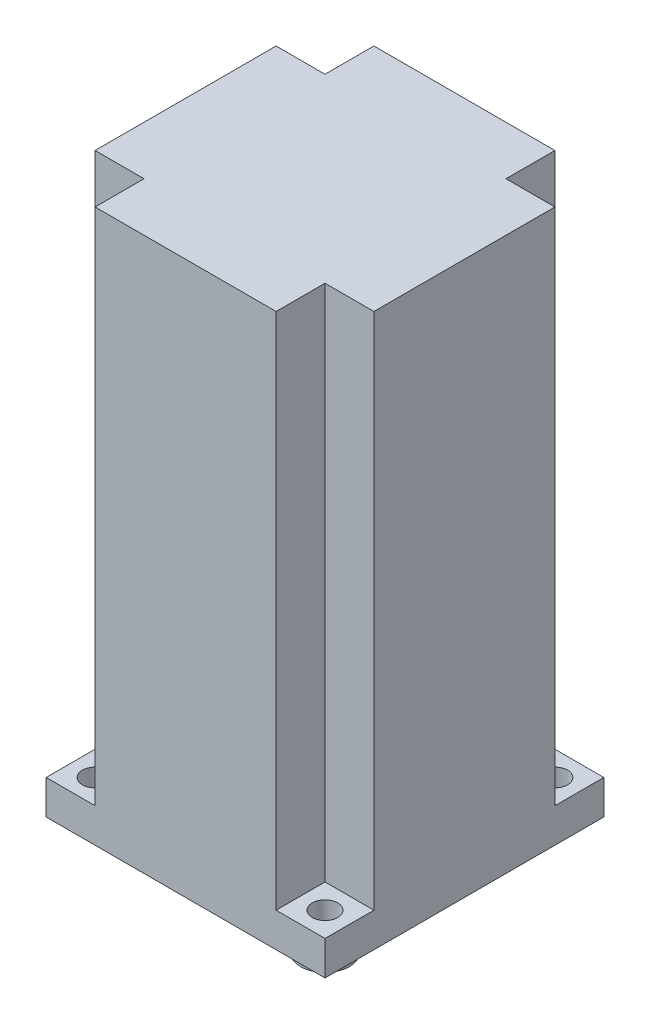
ISO-10303-21;
HEADER;
FILE_DESCRIPTION(('STEP AP214'),'2;1');
FILE_NAME('part.step','',(''),(''),'','','');
FILE_SCHEMA(('AUTOMOTIVE_DESIGN { 1 0 10303 214 1 1 1 1 }'));
ENDSEC;
DATA;
#1=APPLICATION_CONTEXT('core data for automotive mechanical design processes');
#2=APPLICATION_PROTOCOL_DEFINITION('international standard','automotive_design',2000,#1);
#3=PRODUCT_CONTEXT('',#1,'mechanical');
#4=PRODUCT('Part','Part','',(#3));
#5=PRODUCT_RELATED_PRODUCT_CATEGORY('part','',(#4));
#6=PRODUCT_DEFINITION_FORMATION('','',#4);
#7=PRODUCT_DEFINITION_CONTEXT('part definition',#1,'design');
#8=PRODUCT_DEFINITION('design','',#6,#7);
#9=PRODUCT_DEFINITION_SHAPE('','',#8);
#10=(LENGTH_UNIT() NAMED_UNIT(*) SI_UNIT(.MILLI.,.METRE.));
#11=(NAMED_UNIT(*) PLANE_ANGLE_UNIT() SI_UNIT($,.RADIAN.));
#12=(NAMED_UNIT(*) SI_UNIT($,.STERADIAN.) SOLID_ANGLE_UNIT());
#13=UNCERTAINTY_MEASURE_WITH_UNIT(LENGTH_MEASURE(1.E-05),#10,'distance_accuracy_value','');
#14=(GEOMETRIC_REPRESENTATION_CONTEXT(3) GLOBAL_UNCERTAINTY_ASSIGNED_CONTEXT((#13)) GLOBAL_UNIT_ASSIGNED_CONTEXT((#10,
#11,#12)) REPRESENTATION_CONTEXT('',''));
#15=CARTESIAN_POINT('',(0.,0.,0.));
#16=DIRECTION('',(0.,0.,1.));
#17=DIRECTION('',(1.,0.,0.));
#18=AXIS2_PLACEMENT_3D('',#15,#16,#17);
#19=CARTESIAN_POINT('',(0.,113.,0.));
#20=DIRECTION('',(0.,-1.,0.));
#21=DIRECTION('',(0.,0.,-1.));
#22=AXIS2_PLACEMENT_3D('',#19,#20,#21);
#23=PLANE('',#22);
#24=DIRECTION('',(-1.,0.,0.));
#25=VECTOR('',#24,1.);
#26=CARTESIAN_POINT('',(28.5,113.,-18.5));
#27=LINE('',#26,#25);
#28=CARTESIAN_POINT('',(28.5,113.,-18.5));
#29=VERTEX_POINT('',#28);
#30=CARTESIAN_POINT('',(18.5,113.,-18.5));
#31=VERTEX_POINT('',#30);
#32=EDGE_CURVE('E151',#29,#31,#27,.T.);
#33=ORIENTED_EDGE('',*,*,#32,.T.);
#34=DIRECTION('',(0.,0.,1.));
#35=VECTOR('',#34,1.);
#36=CARTESIAN_POINT('',(18.5,113.,-28.5));
#37=LINE('',#36,#35);
#38=CARTESIAN_POINT('',(18.5,113.,-28.5));
#39=VERTEX_POINT('',#38);
#40=EDGE_CURVE('E162',#39,#31,#37,.T.);
#41=ORIENTED_EDGE('',*,*,#40,.F.);
#42=DIRECTION('',(-1.,0.,0.));
#43=VECTOR('',#42,1.);
#44=CARTESIAN_POINT('',(28.5,113.,-28.5));
#45=LINE('',#44,#43);
#46=CARTESIAN_POINT('',(-18.5,113.,-28.5));
#47=VERTEX_POINT('',#46);
#48=EDGE_CURVE('E177',#39,#47,#45,.T.);
#49=ORIENTED_EDGE('',*,*,#48,.T.);
#50=DIRECTION('',(0.,0.,1.));
#51=VECTOR('',#50,1.);
#52=CARTESIAN_POINT('',(-18.5,113.,0.));
#53=LINE('',#52,#51);
#54=CARTESIAN_POINT('',(-18.5,113.,-18.5));
#55=VERTEX_POINT('',#54);
#56=EDGE_CURVE('E211',#47,#55,#53,.T.);
#57=ORIENTED_EDGE('',*,*,#56,.T.);
#58=DIRECTION('',(1.,0.,0.));
#59=VECTOR('',#58,1.);
#60=CARTESIAN_POINT('',(0.,113.,-18.5));
#61=LINE('',#60,#59);
#62=CARTESIAN_POINT('',(-28.5,113.,-18.5));
#63=VERTEX_POINT('',#62);
#64=EDGE_CURVE('E217',#63,#55,#61,.T.);
#65=ORIENTED_EDGE('',*,*,#64,.F.);
#66=DIRECTION('',(0.,0.,1.));
#67=VECTOR('',#66,1.);
#68=CARTESIAN_POINT('',(-28.5,113.,-28.5));
#69=LINE('',#68,#67);
#70=CARTESIAN_POINT('',(-28.5,113.,18.5));
#71=VERTEX_POINT('',#70);
#72=EDGE_CURVE('E183',#63,#71,#69,.T.);
#73=ORIENTED_EDGE('',*,*,#72,.T.);
#74=DIRECTION('',(1.,0.,0.));
#75=VECTOR('',#74,1.);
#76=CARTESIAN_POINT('',(0.,113.,18.5));
#77=LINE('',#76,#75);
#78=CARTESIAN_POINT('',(-18.5,113.,18.5));
#79=VERTEX_POINT('',#78);
#80=EDGE_CURVE('E252',#71,#79,#77,.T.);
#81=ORIENTED_EDGE('',*,*,#80,.T.);
#82=DIRECTION('',(0.,0.,-1.));
#83=VECTOR('',#82,1.);
#84=CARTESIAN_POINT('',(-18.5,113.,0.));
#85=LINE('',#84,#83);
#86=CARTESIAN_POINT('',(-18.5,113.,28.5));
#87=VERTEX_POINT('',#86);
#88=EDGE_CURVE('E206',#87,#79,#85,.T.);
#89=ORIENTED_EDGE('',*,*,#88,.F.);
#90=DIRECTION('',(1.,0.,0.));
#91=VECTOR('',#90,1.);
#92=CARTESIAN_POINT('',(28.5,113.,28.5));
#93=LINE('',#92,#91);
#94=CARTESIAN_POINT('',(18.5,113.,28.5));
#95=VERTEX_POINT('',#94);
#96=EDGE_CURVE('E178',#87,#95,#93,.T.);
#97=ORIENTED_EDGE('',*,*,#96,.T.);
#98=DIRECTION('',(0.,0.,-1.));
#99=VECTOR('',#98,1.);
#100=CARTESIAN_POINT('',(18.5,113.,0.));
#101=LINE('',#100,#99);
#102=CARTESIAN_POINT('',(18.5,113.,18.5));
#103=VERTEX_POINT('',#102);
#104=EDGE_CURVE('E207',#95,#103,#101,.T.);
#105=ORIENTED_EDGE('',*,*,#104,.T.);
#106=DIRECTION('',(-1.,0.,0.));
#107=VECTOR('',#106,1.);
#108=CARTESIAN_POINT('',(0.,113.,18.5));
#109=LINE('',#108,#107);
#110=CARTESIAN_POINT('',(28.5,113.,18.5));
#111=VERTEX_POINT('',#110);
#112=EDGE_CURVE('E176',#111,#103,#109,.T.);
#113=ORIENTED_EDGE('',*,*,#112,.F.);
#114=DIRECTION('',(0.,0.,-1.));
#115=VECTOR('',#114,1.);
#116=CARTESIAN_POINT('',(28.5,113.,-28.5));
#117=LINE('',#116,#115);
#118=EDGE_CURVE('E169',#111,#29,#117,.T.);
#119=ORIENTED_EDGE('',*,*,#118,.T.);
#120=EDGE_LOOP('',(#33,#41,#49,#57,#65,#73,#81,#89,#97,#105,#113,#119));
#121=FACE_BOUND('',#120,.T.);
#122=ADVANCED_FACE('F38',(#121),#23,.F.);
#123=CARTESIAN_POINT('',(28.5,113.,-28.5));
#124=DIRECTION('',(-1.,0.,0.));
#125=DIRECTION('',(0.,0.,1.));
#126=AXIS2_PLACEMENT_3D('',#123,#124,#125);
#127=PLANE('',#126);
#128=DIRECTION('',(0.,1.,0.));
#129=VECTOR('',#128,1.);
#130=CARTESIAN_POINT('',(28.5,7.00000000000001,-18.5));
#131=LINE('',#130,#129);
#132=CARTESIAN_POINT('',(28.5,7.00000000000001,-18.5));
#133=VERTEX_POINT('',#132);
#134=EDGE_CURVE('E154',#133,#29,#131,.T.);
#135=ORIENTED_EDGE('',*,*,#134,.T.);
#136=ORIENTED_EDGE('',*,*,#118,.F.);
#137=DIRECTION('',(0.,1.,0.));
#138=VECTOR('',#137,1.);
#139=CARTESIAN_POINT('',(28.5,7.00000000000001,18.5));
#140=LINE('',#139,#138);
#141=CARTESIAN_POINT('',(28.5,7.00000000000001,18.5));
#142=VERTEX_POINT('',#141);
#143=EDGE_CURVE('E214',#142,#111,#140,.T.);
#144=ORIENTED_EDGE('',*,*,#143,.F.);
#145=DIRECTION('',(0.,0.,-1.));
#146=VECTOR('',#145,1.);
#147=CARTESIAN_POINT('',(28.5,7.00000000000001,0.));
#148=LINE('',#147,#146);
#149=CARTESIAN_POINT('',(28.5,7.00000000000001,28.5));
#150=VERTEX_POINT('',#149);
#151=EDGE_CURVE('E243',#150,#142,#148,.T.);
#152=ORIENTED_EDGE('',*,*,#151,.F.);
#153=DIRECTION('',(0.,-1.,0.));
#154=VECTOR('',#153,1.);
#155=CARTESIAN_POINT('',(28.5,113.,28.5));
#156=LINE('',#155,#154);
#157=CARTESIAN_POINT('',(28.5,0.,28.5));
#158=VERTEX_POINT('',#157);
#159=EDGE_CURVE('E47',#150,#158,#156,.T.);
#160=ORIENTED_EDGE('',*,*,#159,.T.);
#161=DIRECTION('',(0.,0.,-1.));
#162=VECTOR('',#161,1.);
#163=CARTESIAN_POINT('',(28.5,0.,-28.5));
#164=LINE('',#163,#162);
#165=CARTESIAN_POINT('',(28.5,0.,-28.5));
#166=VERTEX_POINT('',#165);
#167=EDGE_CURVE('E194',#158,#166,#164,.T.);
#168=ORIENTED_EDGE('',*,*,#167,.T.);
#169=DIRECTION('',(0.,-1.,0.));
#170=VECTOR('',#169,1.);
#171=CARTESIAN_POINT('',(28.5,113.,-28.5));
#172=LINE('',#171,#170);
#173=CARTESIAN_POINT('',(28.5,7.00000000000001,-28.5));
#174=VERTEX_POINT('',#173);
#175=EDGE_CURVE('E201',#174,#166,#172,.T.);
#176=ORIENTED_EDGE('',*,*,#175,.F.);
#177=DIRECTION('',(0.,0.,1.));
#178=VECTOR('',#177,1.);
#179=CARTESIAN_POINT('',(28.5,7.00000000000001,-28.5));
#180=LINE('',#179,#178);
#181=EDGE_CURVE('E171',#174,#133,#180,.T.);
#182=ORIENTED_EDGE('',*,*,#181,.T.);
#183=EDGE_LOOP('',(#135,#136,#144,#152,#160,#168,#176,#182));
#184=FACE_BOUND('',#183,.T.);
#185=ADVANCED_FACE('F167',(#184),#127,.F.);
#186=CARTESIAN_POINT('',(23.5,0.,-23.5));
#187=DIRECTION('',(0.,-1.,0.));
#188=DIRECTION('',(0.,0.,-1.));
#189=AXIS2_PLACEMENT_3D('',#186,#187,#188);
#190=CYLINDRICAL_SURFACE('',#189,2.59999999999998);
#191=CARTESIAN_POINT('',(23.5,0.,-23.5));
#192=DIRECTION('',(0.,-1.,0.));
#193=DIRECTION('',(0.,0.,-1.));
#194=AXIS2_PLACEMENT_3D('',#191,#192,#193);
#195=CIRCLE('',#194,2.59999999999999);
#196=CARTESIAN_POINT('',(23.5,0.,-26.1));
#197=VERTEX_POINT('',#196);
#198=EDGE_CURVE('E279',#197,#197,#195,.T.);
#199=ORIENTED_EDGE('',*,*,#198,.T.);
#200=EDGE_LOOP('',(#199));
#201=FACE_BOUND('',#200,.T.);
#202=CARTESIAN_POINT('',(23.5,7.00000000000001,-23.5));
#203=DIRECTION('',(0.,1.,0.));
#204=DIRECTION('',(0.,0.,1.));
#205=AXIS2_PLACEMENT_3D('',#202,#203,#204);
#206=CIRCLE('',#205,2.59999999999998);
#207=CARTESIAN_POINT('',(23.5,7.00000000000001,-20.9));
#208=VERTEX_POINT('',#207);
#209=EDGE_CURVE('E42',#208,#208,#206,.F.);
#210=ORIENTED_EDGE('',*,*,#209,.F.);
#211=EDGE_LOOP('',(#210));
#212=FACE_BOUND('',#211,.T.);
#213=ADVANCED_FACE('F339',(#201,#212),#190,.F.);
#214=CARTESIAN_POINT('',(28.5,113.,-28.5));
#215=DIRECTION('',(0.,0.,1.));
#216=DIRECTION('',(1.,0.,0.));
#217=AXIS2_PLACEMENT_3D('',#214,#215,#216);
#218=PLANE('',#217);
#219=ORIENTED_EDGE('',*,*,#48,.F.);
#220=DIRECTION('',(0.,1.,0.));
#221=VECTOR('',#220,1.);
#222=CARTESIAN_POINT('',(18.5,7.00000000000001,-28.5));
#223=LINE('',#222,#221);
#224=CARTESIAN_POINT('',(18.5,7.00000000000001,-28.5));
#225=VERTEX_POINT('',#224);
#226=EDGE_CURVE('E392',#225,#39,#223,.T.);
#227=ORIENTED_EDGE('',*,*,#226,.F.);
#228=DIRECTION('',(-1.,0.,0.));
#229=VECTOR('',#228,1.);
#230=CARTESIAN_POINT('',(28.5,7.00000000000001,-28.5));
#231=LINE('',#230,#229);
#232=EDGE_CURVE('E163',#174,#225,#231,.T.);
#233=ORIENTED_EDGE('',*,*,#232,.F.);
#234=ORIENTED_EDGE('',*,*,#175,.T.);
#235=DIRECTION('',(-1.,0.,0.));
#236=VECTOR('',#235,1.);
#237=CARTESIAN_POINT('',(28.5,0.,-28.5));
#238=LINE('',#237,#236);
#239=CARTESIAN_POINT('',(-28.5,0.,-28.5));
#240=VERTEX_POINT('',#239);
#241=EDGE_CURVE('E197',#166,#240,#238,.T.);
#242=ORIENTED_EDGE('',*,*,#241,.T.);
#243=DIRECTION('',(0.,-1.,0.));
#244=VECTOR('',#243,1.);
#245=CARTESIAN_POINT('',(-28.5,113.,-28.5));
#246=LINE('',#245,#244);
#247=CARTESIAN_POINT('',(-28.5,7.00000000000001,-28.5));
#248=VERTEX_POINT('',#247);
#249=EDGE_CURVE('E180',#248,#240,#246,.T.);
#250=ORIENTED_EDGE('',*,*,#249,.F.);
#251=DIRECTION('',(-1.,0.,0.));
#252=VECTOR('',#251,1.);
#253=CARTESIAN_POINT('',(0.,7.00000000000001,-28.5));
#254=LINE('',#253,#252);
#255=CARTESIAN_POINT('',(-18.5,7.00000000000001,-28.5));
#256=VERTEX_POINT('',#255);
#257=EDGE_CURVE('E230',#256,#248,#254,.T.);
#258=ORIENTED_EDGE('',*,*,#257,.F.);
#259=DIRECTION('',(0.,1.,0.));
#260=VECTOR('',#259,1.);
#261=CARTESIAN_POINT('',(-18.5,7.00000000000001,-28.5));
#262=LINE('',#261,#260);
#263=EDGE_CURVE('E228',#256,#47,#262,.T.);
#264=ORIENTED_EDGE('',*,*,#263,.T.);
#265=EDGE_LOOP('',(#219,#227,#233,#234,#242,#250,#258,#264));
#266=FACE_BOUND('',#265,.T.);
#267=ADVANCED_FACE('F350',(#266),#218,.F.);
#268=CARTESIAN_POINT('',(-23.5,0.,-23.5));
#269=DIRECTION('',(0.,-1.,0.));
#270=DIRECTION('',(0.,0.,-1.));
#271=AXIS2_PLACEMENT_3D('',#268,#269,#270);
#272=CYLINDRICAL_SURFACE('',#271,2.59999999999998);
#273=CARTESIAN_POINT('',(-23.5,0.,-23.5));
#274=DIRECTION('',(0.,-1.,0.));
#275=DIRECTION('',(0.,0.,-1.));
#276=AXIS2_PLACEMENT_3D('',#273,#274,#275);
#277=CIRCLE('',#276,2.59999999999999);
#278=CARTESIAN_POINT('',(-23.5,0.,-26.1));
#279=VERTEX_POINT('',#278);
#280=EDGE_CURVE('E282',#279,#279,#277,.T.);
#281=ORIENTED_EDGE('',*,*,#280,.T.);
#282=EDGE_LOOP('',(#281));
#283=FACE_BOUND('',#282,.T.);
#284=CARTESIAN_POINT('',(-23.5,7.00000000000001,-23.5));
#285=DIRECTION('',(0.,1.,0.));
#286=DIRECTION('',(0.,0.,1.));
#287=AXIS2_PLACEMENT_3D('',#284,#285,#286);
#288=CIRCLE('',#287,2.59999999999998);
#289=CARTESIAN_POINT('',(-23.5,7.00000000000001,-20.9));
#290=VERTEX_POINT('',#289);
#291=EDGE_CURVE('E208',#290,#290,#288,.F.);
#292=ORIENTED_EDGE('',*,*,#291,.F.);
#293=EDGE_LOOP('',(#292));
#294=FACE_BOUND('',#293,.T.);
#295=ADVANCED_FACE('F352',(#283,#294),#272,.F.);
#296=CARTESIAN_POINT('',(28.5,113.,28.5));
#297=DIRECTION('',(0.,0.,-1.));
#298=DIRECTION('',(-1.,0.,0.));
#299=AXIS2_PLACEMENT_3D('',#296,#297,#298);
#300=PLANE('',#299);
#301=DIRECTION('',(0.,1.,0.));
#302=VECTOR('',#301,1.);
#303=CARTESIAN_POINT('',(18.5,7.00000000000001,28.5));
#304=LINE('',#303,#302);
#305=CARTESIAN_POINT('',(18.5,7.00000000000001,28.5));
#306=VERTEX_POINT('',#305);
#307=EDGE_CURVE('E233',#306,#95,#304,.T.);
#308=ORIENTED_EDGE('',*,*,#307,.T.);
#309=ORIENTED_EDGE('',*,*,#96,.F.);
#310=DIRECTION('',(0.,1.,0.));
#311=VECTOR('',#310,1.);
#312=CARTESIAN_POINT('',(-18.5,7.00000000000001,28.5));
#313=LINE('',#312,#311);
#314=CARTESIAN_POINT('',(-18.5,7.00000000000001,28.5));
#315=VERTEX_POINT('',#314);
#316=EDGE_CURVE('E262',#315,#87,#313,.T.);
#317=ORIENTED_EDGE('',*,*,#316,.F.);
#318=DIRECTION('',(1.,0.,0.));
#319=VECTOR('',#318,1.);
#320=CARTESIAN_POINT('',(0.,7.00000000000001,28.5));
#321=LINE('',#320,#319);
#322=CARTESIAN_POINT('',(-28.5,7.00000000000001,28.5));
#323=VERTEX_POINT('',#322);
#324=EDGE_CURVE('E251',#323,#315,#321,.T.);
#325=ORIENTED_EDGE('',*,*,#324,.F.);
#326=DIRECTION('',(0.,-1.,0.));
#327=VECTOR('',#326,1.);
#328=CARTESIAN_POINT('',(-28.5,113.,28.5));
#329=LINE('',#328,#327);
#330=CARTESIAN_POINT('',(-28.5,0.,28.5));
#331=VERTEX_POINT('',#330);
#332=EDGE_CURVE('E11',#323,#331,#329,.T.);
#333=ORIENTED_EDGE('',*,*,#332,.T.);
#334=DIRECTION('',(1.,0.,0.));
#335=VECTOR('',#334,1.);
#336=CARTESIAN_POINT('',(28.5,0.,28.5));
#337=LINE('',#336,#335);
#338=EDGE_CURVE('E190',#331,#158,#337,.T.);
#339=ORIENTED_EDGE('',*,*,#338,.T.);
#340=ORIENTED_EDGE('',*,*,#159,.F.);
#341=DIRECTION('',(1.,0.,0.));
#342=VECTOR('',#341,1.);
#343=CARTESIAN_POINT('',(0.,7.00000000000001,28.5));
#344=LINE('',#343,#342);
#345=EDGE_CURVE('E245',#306,#150,#344,.T.);
#346=ORIENTED_EDGE('',*,*,#345,.F.);
#347=EDGE_LOOP('',(#308,#309,#317,#325,#333,#339,#340,#346));
#348=FACE_BOUND('',#347,.T.);
#349=ADVANCED_FACE('F305',(#348),#300,.F.);
#350=CARTESIAN_POINT('',(23.5,0.,23.5));
#351=DIRECTION('',(0.,-1.,0.));
#352=DIRECTION('',(0.,0.,-1.));
#353=AXIS2_PLACEMENT_3D('',#350,#351,#352);
#354=CYLINDRICAL_SURFACE('',#353,2.59999999999998);
#355=CARTESIAN_POINT('',(23.5,0.,23.5));
#356=DIRECTION('',(0.,-1.,0.));
#357=DIRECTION('',(0.,0.,-1.));
#358=AXIS2_PLACEMENT_3D('',#355,#356,#357);
#359=CIRCLE('',#358,2.59999999999999);
#360=CARTESIAN_POINT('',(23.5,0.,20.9));
#361=VERTEX_POINT('',#360);
#362=EDGE_CURVE('E276',#361,#361,#359,.T.);
#363=ORIENTED_EDGE('',*,*,#362,.T.);
#364=EDGE_LOOP('',(#363));
#365=FACE_BOUND('',#364,.T.);
#366=CARTESIAN_POINT('',(23.5,7.00000000000001,23.5));
#367=DIRECTION('',(0.,1.,0.));
#368=DIRECTION('',(0.,0.,1.));
#369=AXIS2_PLACEMENT_3D('',#366,#367,#368);
#370=CIRCLE('',#369,2.59999999999998);
#371=CARTESIAN_POINT('',(23.5,7.00000000000001,26.1));
#372=VERTEX_POINT('',#371);
#373=EDGE_CURVE('E204',#372,#372,#370,.F.);
#374=ORIENTED_EDGE('',*,*,#373,.F.);
#375=EDGE_LOOP('',(#374));
#376=FACE_BOUND('',#375,.T.);
#377=ADVANCED_FACE('F355',(#365,#376),#354,.F.);
#378=CARTESIAN_POINT('',(-28.5,113.,-28.5));
#379=DIRECTION('',(1.,0.,0.));
#380=DIRECTION('',(0.,0.,-1.));
#381=AXIS2_PLACEMENT_3D('',#378,#379,#380);
#382=PLANE('',#381);
#383=ORIENTED_EDGE('',*,*,#72,.F.);
#384=DIRECTION('',(0.,1.,0.));
#385=VECTOR('',#384,1.);
#386=CARTESIAN_POINT('',(-28.5,7.00000000000001,-18.5));
#387=LINE('',#386,#385);
#388=CARTESIAN_POINT('',(-28.5,7.00000000000001,-18.5));
#389=VERTEX_POINT('',#388);
#390=EDGE_CURVE('E400',#389,#63,#387,.T.);
#391=ORIENTED_EDGE('',*,*,#390,.F.);
#392=DIRECTION('',(0.,0.,1.));
#393=VECTOR('',#392,1.);
#394=CARTESIAN_POINT('',(-28.5,7.00000000000001,0.));
#395=LINE('',#394,#393);
#396=EDGE_CURVE('E227',#248,#389,#395,.T.);
#397=ORIENTED_EDGE('',*,*,#396,.F.);
#398=ORIENTED_EDGE('',*,*,#249,.T.);
#399=DIRECTION('',(0.,0.,1.));
#400=VECTOR('',#399,1.);
#401=CARTESIAN_POINT('',(-28.5,0.,-28.5));
#402=LINE('',#401,#400);
#403=EDGE_CURVE('E187',#240,#331,#402,.T.);
#404=ORIENTED_EDGE('',*,*,#403,.T.);
#405=ORIENTED_EDGE('',*,*,#332,.F.);
#406=DIRECTION('',(0.,0.,1.));
#407=VECTOR('',#406,1.);
#408=CARTESIAN_POINT('',(-28.5,7.00000000000001,0.));
#409=LINE('',#408,#407);
#410=CARTESIAN_POINT('',(-28.5,7.00000000000001,18.5));
#411=VERTEX_POINT('',#410);
#412=EDGE_CURVE('E260',#411,#323,#409,.T.);
#413=ORIENTED_EDGE('',*,*,#412,.F.);
#414=DIRECTION('',(0.,1.,0.));
#415=VECTOR('',#414,1.);
#416=CARTESIAN_POINT('',(-28.5,7.00000000000001,18.5));
#417=LINE('',#416,#415);
#418=EDGE_CURVE('E267',#411,#71,#417,.T.);
#419=ORIENTED_EDGE('',*,*,#418,.T.);
#420=EDGE_LOOP('',(#383,#391,#397,#398,#404,#405,#413,#419));
#421=FACE_BOUND('',#420,.T.);
#422=ADVANCED_FACE('F40',(#421),#382,.F.);
#423=CARTESIAN_POINT('',(-23.5,0.,23.5));
#424=DIRECTION('',(0.,-1.,0.));
#425=DIRECTION('',(0.,0.,-1.));
#426=AXIS2_PLACEMENT_3D('',#423,#424,#425);
#427=CYLINDRICAL_SURFACE('',#426,2.59999999999998);
#428=CARTESIAN_POINT('',(-23.5,0.,23.5));
#429=DIRECTION('',(0.,-1.,0.));
#430=DIRECTION('',(0.,0.,-1.));
#431=AXIS2_PLACEMENT_3D('',#428,#429,#430);
#432=CIRCLE('',#431,2.59999999999999);
#433=CARTESIAN_POINT('',(-23.5,0.,20.9));
#434=VERTEX_POINT('',#433);
#435=EDGE_CURVE('E270',#434,#434,#432,.T.);
#436=ORIENTED_EDGE('',*,*,#435,.T.);
#437=EDGE_LOOP('',(#436));
#438=FACE_BOUND('',#437,.T.);
#439=CARTESIAN_POINT('',(-23.5,7.00000000000001,23.5));
#440=DIRECTION('',(0.,1.,0.));
#441=DIRECTION('',(0.,0.,1.));
#442=AXIS2_PLACEMENT_3D('',#439,#440,#441);
#443=CIRCLE('',#442,2.59999999999998);
#444=CARTESIAN_POINT('',(-23.5,7.00000000000001,26.1));
#445=VERTEX_POINT('',#444);
#446=EDGE_CURVE('E248',#445,#445,#443,.F.);
#447=ORIENTED_EDGE('',*,*,#446,.F.);
#448=EDGE_LOOP('',(#447));
#449=FACE_BOUND('',#448,.T.);
#450=ADVANCED_FACE('F348',(#438,#449),#427,.F.);
#451=CARTESIAN_POINT('',(0.,0.,0.));
#452=DIRECTION('',(0.,-1.,0.));
#453=DIRECTION('',(0.,0.,-1.));
#454=AXIS2_PLACEMENT_3D('',#451,#452,#453);
#455=PLANE('',#454);
#456=ORIENTED_EDGE('',*,*,#435,.F.);
#457=EDGE_LOOP('',(#456));
#458=FACE_BOUND('',#457,.T.);
#459=ORIENTED_EDGE('',*,*,#362,.F.);
#460=EDGE_LOOP('',(#459));
#461=FACE_BOUND('',#460,.T.);
#462=ORIENTED_EDGE('',*,*,#198,.F.);
#463=EDGE_LOOP('',(#462));
#464=FACE_BOUND('',#463,.T.);
#465=ORIENTED_EDGE('',*,*,#280,.F.);
#466=EDGE_LOOP('',(#465));
#467=FACE_BOUND('',#466,.T.);
#468=CARTESIAN_POINT('',(0.,0.,0.));
#469=DIRECTION('',(0.,-1.,0.));
#470=DIRECTION('',(0.,0.,-1.));
#471=AXIS2_PLACEMENT_3D('',#468,#469,#470);
#472=CIRCLE('',#471,5.);
#473=CARTESIAN_POINT('',(0.,0.,-5.));
#474=VERTEX_POINT('',#473);
#475=EDGE_CURVE('E285',#474,#474,#472,.T.);
#476=ORIENTED_EDGE('',*,*,#475,.F.);
#477=EDGE_LOOP('',(#476));
#478=FACE_BOUND('',#477,.T.);
#479=ORIENTED_EDGE('',*,*,#403,.F.);
#480=ORIENTED_EDGE('',*,*,#241,.F.);
#481=ORIENTED_EDGE('',*,*,#167,.F.);
#482=ORIENTED_EDGE('',*,*,#338,.F.);
#483=EDGE_LOOP('',(#479,#480,#481,#482));
#484=FACE_BOUND('',#483,.T.);
#485=ADVANCED_FACE('F345',(#458,#461,#464,#467,#478,#484),#455,.T.);
#486=CARTESIAN_POINT('',(0.,-24.,0.));
#487=DIRECTION('',(0.,1.,0.));
#488=DIRECTION('',(0.,0.,1.));
#489=AXIS2_PLACEMENT_3D('',#486,#487,#488);
#490=CYLINDRICAL_SURFACE('',#489,5.);
#491=CARTESIAN_POINT('',(0.,-24.,0.));
#492=DIRECTION('',(0.,-1.,0.));
#493=DIRECTION('',(0.,0.,-1.));
#494=AXIS2_PLACEMENT_3D('',#491,#492,#493);
#495=CIRCLE('',#494,5.);
#496=CARTESIAN_POINT('',(0.,-24.,-5.));
#497=VERTEX_POINT('',#496);
#498=EDGE_CURVE('E191',#497,#497,#495,.T.);
#499=ORIENTED_EDGE('',*,*,#498,.F.);
#500=EDGE_LOOP('',(#499));
#501=FACE_BOUND('',#500,.T.);
#502=ORIENTED_EDGE('',*,*,#475,.T.);
#503=EDGE_LOOP('',(#502));
#504=FACE_BOUND('',#503,.T.);
#505=ADVANCED_FACE('F343',(#501,#504),#490,.T.);
#506=CARTESIAN_POINT('',(0.,-24.,0.));
#507=DIRECTION('',(0.,-1.,0.));
#508=DIRECTION('',(0.,0.,-1.));
#509=AXIS2_PLACEMENT_3D('',#506,#507,#508);
#510=PLANE('',#509);
#511=ORIENTED_EDGE('',*,*,#498,.T.);
#512=EDGE_LOOP('',(#511));
#513=FACE_BOUND('',#512,.T.);
#514=ADVANCED_FACE('F368',(#513),#510,.T.);
#515=CARTESIAN_POINT('',(0.,7.00000000000001,18.5));
#516=DIRECTION('',(0.,0.,1.));
#517=DIRECTION('',(1.,0.,0.));
#518=AXIS2_PLACEMENT_3D('',#515,#516,#517);
#519=PLANE('',#518);
#520=ORIENTED_EDGE('',*,*,#80,.F.);
#521=ORIENTED_EDGE('',*,*,#418,.F.);
#522=DIRECTION('',(1.,0.,0.));
#523=VECTOR('',#522,1.);
#524=CARTESIAN_POINT('',(0.,7.00000000000001,18.5));
#525=LINE('',#524,#523);
#526=CARTESIAN_POINT('',(-18.5,7.00000000000001,18.5));
#527=VERTEX_POINT('',#526);
#528=EDGE_CURVE('E258',#411,#527,#525,.T.);
#529=ORIENTED_EDGE('',*,*,#528,.T.);
#530=DIRECTION('',(0.,1.,0.));
#531=VECTOR('',#530,1.);
#532=CARTESIAN_POINT('',(-18.5,7.00000000000001,18.5));
#533=LINE('',#532,#531);
#534=EDGE_CURVE('E271',#527,#79,#533,.T.);
#535=ORIENTED_EDGE('',*,*,#534,.T.);
#536=EDGE_LOOP('',(#520,#521,#529,#535));
#537=FACE_BOUND('',#536,.T.);
#538=ADVANCED_FACE('F295',(#537),#519,.T.);
#539=CARTESIAN_POINT('',(-18.5,7.00000000000001,0.));
#540=DIRECTION('',(1.,0.,0.));
#541=DIRECTION('',(0.,0.,-1.));
#542=AXIS2_PLACEMENT_3D('',#539,#540,#541);
#543=PLANE('',#542);
#544=ORIENTED_EDGE('',*,*,#88,.T.);
#545=ORIENTED_EDGE('',*,*,#534,.F.);
#546=DIRECTION('',(0.,0.,-1.));
#547=VECTOR('',#546,1.);
#548=CARTESIAN_POINT('',(-18.5,7.00000000000001,0.));
#549=LINE('',#548,#547);
#550=EDGE_CURVE('E255',#315,#527,#549,.T.);
#551=ORIENTED_EDGE('',*,*,#550,.F.);
#552=ORIENTED_EDGE('',*,*,#316,.T.);
#553=EDGE_LOOP('',(#544,#545,#551,#552));
#554=FACE_BOUND('',#553,.T.);
#555=ADVANCED_FACE('F309',(#554),#543,.F.);
#556=CARTESIAN_POINT('',(0.,7.00000000000001,0.));
#557=DIRECTION('',(0.,1.,0.));
#558=DIRECTION('',(0.,0.,1.));
#559=AXIS2_PLACEMENT_3D('',#556,#557,#558);
#560=PLANE('',#559);
#561=ORIENTED_EDGE('',*,*,#446,.T.);
#562=EDGE_LOOP('',(#561));
#563=FACE_BOUND('',#562,.T.);
#564=ORIENTED_EDGE('',*,*,#324,.T.);
#565=ORIENTED_EDGE('',*,*,#550,.T.);
#566=ORIENTED_EDGE('',*,*,#528,.F.);
#567=ORIENTED_EDGE('',*,*,#412,.T.);
#568=EDGE_LOOP('',(#564,#565,#566,#567));
#569=FACE_BOUND('',#568,.T.);
#570=ADVANCED_FACE('F302',(#563,#569),#560,.T.);
#571=CARTESIAN_POINT('',(0.,7.00000000000001,0.));
#572=DIRECTION('',(0.,1.,0.));
#573=DIRECTION('',(0.,0.,1.));
#574=AXIS2_PLACEMENT_3D('',#571,#572,#573);
#575=PLANE('',#574);
#576=DIRECTION('',(0.,0.,-1.));
#577=VECTOR('',#576,1.);
#578=CARTESIAN_POINT('',(18.5,7.00000000000001,0.));
#579=LINE('',#578,#577);
#580=CARTESIAN_POINT('',(18.5,7.00000000000001,18.5));
#581=VERTEX_POINT('',#580);
#582=EDGE_CURVE('E239',#306,#581,#579,.T.);
#583=ORIENTED_EDGE('',*,*,#582,.F.);
#584=ORIENTED_EDGE('',*,*,#345,.T.);
#585=ORIENTED_EDGE('',*,*,#151,.T.);
#586=DIRECTION('',(-1.,0.,0.));
#587=VECTOR('',#586,1.);
#588=CARTESIAN_POINT('',(0.,7.00000000000001,18.5));
#589=LINE('',#588,#587);
#590=EDGE_CURVE('E236',#142,#581,#589,.T.);
#591=ORIENTED_EDGE('',*,*,#590,.T.);
#592=EDGE_LOOP('',(#583,#584,#585,#591));
#593=FACE_BOUND('',#592,.T.);
#594=ORIENTED_EDGE('',*,*,#373,.T.);
#595=EDGE_LOOP('',(#594));
#596=FACE_BOUND('',#595,.T.);
#597=ADVANCED_FACE('F318',(#593,#596),#575,.T.);
#598=CARTESIAN_POINT('',(18.5,7.00000000000001,0.));
#599=DIRECTION('',(1.,0.,0.));
#600=DIRECTION('',(0.,0.,-1.));
#601=AXIS2_PLACEMENT_3D('',#598,#599,#600);
#602=PLANE('',#601);
#603=ORIENTED_EDGE('',*,*,#104,.F.);
#604=ORIENTED_EDGE('',*,*,#307,.F.);
#605=ORIENTED_EDGE('',*,*,#582,.T.);
#606=DIRECTION('',(0.,1.,0.));
#607=VECTOR('',#606,1.);
#608=CARTESIAN_POINT('',(18.5,7.00000000000001,18.5));
#609=LINE('',#608,#607);
#610=EDGE_CURVE('E210',#581,#103,#609,.T.);
#611=ORIENTED_EDGE('',*,*,#610,.T.);
#612=EDGE_LOOP('',(#603,#604,#605,#611));
#613=FACE_BOUND('',#612,.T.);
#614=ADVANCED_FACE('F311',(#613),#602,.T.);
#615=CARTESIAN_POINT('',(0.,7.00000000000001,18.5));
#616=DIRECTION('',(0.,0.,-1.));
#617=DIRECTION('',(-1.,0.,0.));
#618=AXIS2_PLACEMENT_3D('',#615,#616,#617);
#619=PLANE('',#618);
#620=ORIENTED_EDGE('',*,*,#112,.T.);
#621=ORIENTED_EDGE('',*,*,#610,.F.);
#622=ORIENTED_EDGE('',*,*,#590,.F.);
#623=ORIENTED_EDGE('',*,*,#143,.T.);
#624=EDGE_LOOP('',(#620,#621,#622,#623));
#625=FACE_BOUND('',#624,.T.);
#626=ADVANCED_FACE('F322',(#625),#619,.F.);
#627=CARTESIAN_POINT('',(0.,7.00000000000001,0.));
#628=DIRECTION('',(0.,1.,0.));
#629=DIRECTION('',(0.,0.,1.));
#630=AXIS2_PLACEMENT_3D('',#627,#628,#629);
#631=PLANE('',#630);
#632=DIRECTION('',(0.,0.,1.));
#633=VECTOR('',#632,1.);
#634=CARTESIAN_POINT('',(-18.5,7.00000000000001,0.));
#635=LINE('',#634,#633);
#636=CARTESIAN_POINT('',(-18.5,7.00000000000001,-18.5));
#637=VERTEX_POINT('',#636);
#638=EDGE_CURVE('E63',#256,#637,#635,.T.);
#639=ORIENTED_EDGE('',*,*,#638,.F.);
#640=ORIENTED_EDGE('',*,*,#257,.T.);
#641=ORIENTED_EDGE('',*,*,#396,.T.);
#642=DIRECTION('',(1.,0.,0.));
#643=VECTOR('',#642,1.);
#644=CARTESIAN_POINT('',(0.,7.00000000000001,-18.5));
#645=LINE('',#644,#643);
#646=EDGE_CURVE('E225',#389,#637,#645,.T.);
#647=ORIENTED_EDGE('',*,*,#646,.T.);
#648=EDGE_LOOP('',(#639,#640,#641,#647));
#649=FACE_BOUND('',#648,.T.);
#650=ORIENTED_EDGE('',*,*,#291,.T.);
#651=EDGE_LOOP('',(#650));
#652=FACE_BOUND('',#651,.T.);
#653=ADVANCED_FACE('F324',(#649,#652),#631,.T.);
#654=CARTESIAN_POINT('',(-18.5,7.00000000000001,0.));
#655=DIRECTION('',(-1.,0.,0.));
#656=DIRECTION('',(0.,0.,1.));
#657=AXIS2_PLACEMENT_3D('',#654,#655,#656);
#658=PLANE('',#657);
#659=ORIENTED_EDGE('',*,*,#56,.F.);
#660=ORIENTED_EDGE('',*,*,#263,.F.);
#661=ORIENTED_EDGE('',*,*,#638,.T.);
#662=DIRECTION('',(0.,1.,0.));
#663=VECTOR('',#662,1.);
#664=CARTESIAN_POINT('',(-18.5,7.00000000000001,-18.5));
#665=LINE('',#664,#663);
#666=EDGE_CURVE('E401',#637,#55,#665,.T.);
#667=ORIENTED_EDGE('',*,*,#666,.T.);
#668=EDGE_LOOP('',(#659,#660,#661,#667));
#669=FACE_BOUND('',#668,.T.);
#670=ADVANCED_FACE('F330',(#669),#658,.T.);
#671=CARTESIAN_POINT('',(0.,7.00000000000001,-18.5));
#672=DIRECTION('',(0.,0.,1.));
#673=DIRECTION('',(1.,0.,0.));
#674=AXIS2_PLACEMENT_3D('',#671,#672,#673);
#675=PLANE('',#674);
#676=ORIENTED_EDGE('',*,*,#64,.T.);
#677=ORIENTED_EDGE('',*,*,#666,.F.);
#678=ORIENTED_EDGE('',*,*,#646,.F.);
#679=ORIENTED_EDGE('',*,*,#390,.T.);
#680=EDGE_LOOP('',(#676,#677,#678,#679));
#681=FACE_BOUND('',#680,.T.);
#682=ADVANCED_FACE('F414',(#681),#675,.F.);
#683=CARTESIAN_POINT('',(0.,7.00000000000001,0.));
#684=DIRECTION('',(0.,1.,0.));
#685=DIRECTION('',(0.,0.,1.));
#686=AXIS2_PLACEMENT_3D('',#683,#684,#685);
#687=PLANE('',#686);
#688=ORIENTED_EDGE('',*,*,#232,.T.);
#689=DIRECTION('',(0.,0.,1.));
#690=VECTOR('',#689,1.);
#691=CARTESIAN_POINT('',(18.5,7.00000000000001,-28.5));
#692=LINE('',#691,#690);
#693=CARTESIAN_POINT('',(18.5,7.00000000000001,-18.5));
#694=VERTEX_POINT('',#693);
#695=EDGE_CURVE('E393',#225,#694,#692,.T.);
#696=ORIENTED_EDGE('',*,*,#695,.T.);
#697=DIRECTION('',(-1.,0.,0.));
#698=VECTOR('',#697,1.);
#699=CARTESIAN_POINT('',(28.5,7.00000000000001,-18.5));
#700=LINE('',#699,#698);
#701=EDGE_CURVE('E55',#133,#694,#700,.T.);
#702=ORIENTED_EDGE('',*,*,#701,.F.);
#703=ORIENTED_EDGE('',*,*,#181,.F.);
#704=EDGE_LOOP('',(#688,#696,#702,#703));
#705=FACE_BOUND('',#704,.T.);
#706=ORIENTED_EDGE('',*,*,#209,.T.);
#707=EDGE_LOOP('',(#706));
#708=FACE_BOUND('',#707,.T.);
#709=ADVANCED_FACE('F412',(#705,#708),#687,.T.);
#710=CARTESIAN_POINT('',(28.5,7.00000000000001,-18.5));
#711=DIRECTION('',(0.,0.,-1.));
#712=DIRECTION('',(-1.,0.,0.));
#713=AXIS2_PLACEMENT_3D('',#710,#711,#712);
#714=PLANE('',#713);
#715=ORIENTED_EDGE('',*,*,#32,.F.);
#716=ORIENTED_EDGE('',*,*,#134,.F.);
#717=ORIENTED_EDGE('',*,*,#701,.T.);
#718=DIRECTION('',(0.,1.,0.));
#719=VECTOR('',#718,1.);
#720=CARTESIAN_POINT('',(18.5,7.00000000000001,-18.5));
#721=LINE('',#720,#719);
#722=EDGE_CURVE('E157',#694,#31,#721,.T.);
#723=ORIENTED_EDGE('',*,*,#722,.T.);
#724=EDGE_LOOP('',(#715,#716,#717,#723));
#725=FACE_BOUND('',#724,.T.);
#726=ADVANCED_FACE('F153',(#725),#714,.T.);
#727=CARTESIAN_POINT('',(18.5,7.00000000000001,-28.5));
#728=DIRECTION('',(-1.,0.,0.));
#729=DIRECTION('',(0.,0.,1.));
#730=AXIS2_PLACEMENT_3D('',#727,#728,#729);
#731=PLANE('',#730);
#732=ORIENTED_EDGE('',*,*,#40,.T.);
#733=ORIENTED_EDGE('',*,*,#722,.F.);
#734=ORIENTED_EDGE('',*,*,#695,.F.);
#735=ORIENTED_EDGE('',*,*,#226,.T.);
#736=EDGE_LOOP('',(#732,#733,#734,#735));
#737=FACE_BOUND('',#736,.T.);
#738=ADVANCED_FACE('F410',(#737),#731,.F.);
#739=CLOSED_SHELL('',(#122,#185,#213,#267,#295,#349,#377,#422,#450,#485,#505,#514,#538,#555,
#570,#597,#614,#626,#653,#670,#682,#709,#726,#738));
#740=MANIFOLD_SOLID_BREP('B2',#739);
#741=ADVANCED_BREP_SHAPE_REPRESENTATION('',(#18,#740),#14);
#742=SHAPE_DEFINITION_REPRESENTATION(#9,#741);
ENDSEC;
END-ISO-10303-21;
